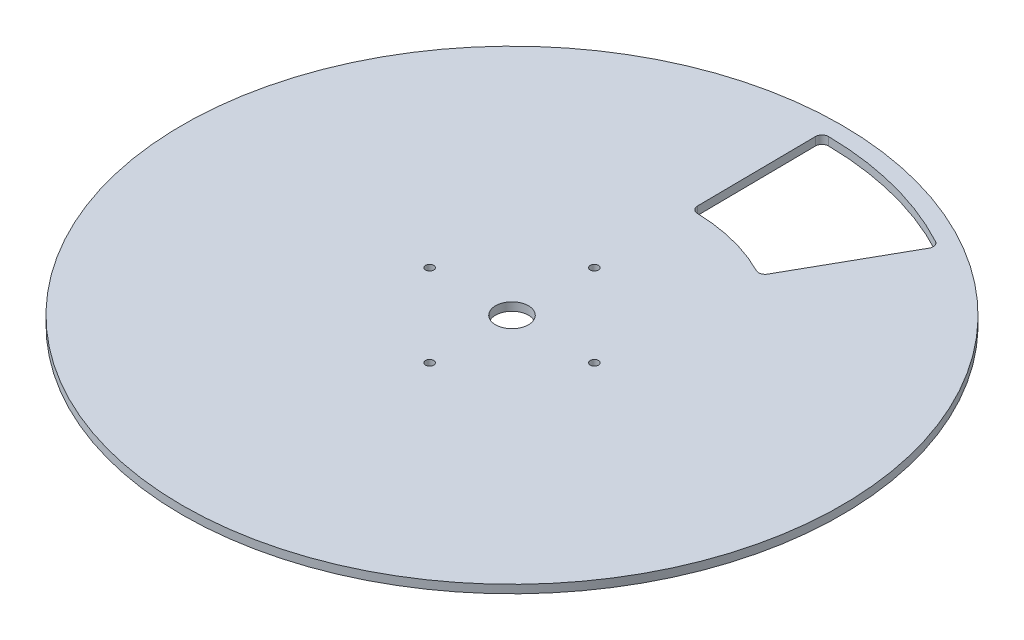
ISO-10303-21;
HEADER;
FILE_DESCRIPTION(('STEP AP214'),'2;1');
FILE_NAME('part.step','',(''),(''),'','','');
FILE_SCHEMA(('AUTOMOTIVE_DESIGN { 1 0 10303 214 1 1 1 1 }'));
ENDSEC;
DATA;
#1=APPLICATION_CONTEXT('core data for automotive mechanical design processes');
#2=APPLICATION_PROTOCOL_DEFINITION('international standard','automotive_design',2000,#1);
#3=PRODUCT_CONTEXT('',#1,'mechanical');
#4=PRODUCT('Part','Part','',(#3));
#5=PRODUCT_RELATED_PRODUCT_CATEGORY('part','',(#4));
#6=PRODUCT_DEFINITION_FORMATION('','',#4);
#7=PRODUCT_DEFINITION_CONTEXT('part definition',#1,'design');
#8=PRODUCT_DEFINITION('design','',#6,#7);
#9=PRODUCT_DEFINITION_SHAPE('','',#8);
#10=(LENGTH_UNIT() NAMED_UNIT(*) SI_UNIT(.MILLI.,.METRE.));
#11=(NAMED_UNIT(*) PLANE_ANGLE_UNIT() SI_UNIT($,.RADIAN.));
#12=(NAMED_UNIT(*) SI_UNIT($,.STERADIAN.) SOLID_ANGLE_UNIT());
#13=UNCERTAINTY_MEASURE_WITH_UNIT(LENGTH_MEASURE(1.E-05),#10,'distance_accuracy_value','');
#14=(GEOMETRIC_REPRESENTATION_CONTEXT(3) GLOBAL_UNCERTAINTY_ASSIGNED_CONTEXT((#13)) GLOBAL_UNIT_ASSIGNED_CONTEXT((#10,
#11,#12)) REPRESENTATION_CONTEXT('',''));
#15=CARTESIAN_POINT('',(0.,0.,0.));
#16=DIRECTION('',(0.,0.,1.));
#17=DIRECTION('',(1.,0.,0.));
#18=AXIS2_PLACEMENT_3D('',#15,#16,#17);
#19=CARTESIAN_POINT('',(0.,3.175,0.));
#20=DIRECTION('',(0.,-1.,0.));
#21=DIRECTION('',(0.,0.,-1.));
#22=AXIS2_PLACEMENT_3D('',#19,#20,#21);
#23=CYLINDRICAL_SURFACE('',#22,127.);
#24=CARTESIAN_POINT('',(0.,3.175,0.));
#25=DIRECTION('',(0.,1.,0.));
#26=DIRECTION('',(0.,0.,1.));
#27=AXIS2_PLACEMENT_3D('',#24,#25,#26);
#28=CIRCLE('',#27,127.);
#29=CARTESIAN_POINT('',(0.,3.175,127.));
#30=VERTEX_POINT('',#29);
#31=EDGE_CURVE('E139',#30,#30,#28,.T.);
#32=ORIENTED_EDGE('',*,*,#31,.F.);
#33=EDGE_LOOP('',(#32));
#34=FACE_BOUND('',#33,.T.);
#35=CARTESIAN_POINT('',(0.,0.,0.));
#36=DIRECTION('',(0.,1.,0.));
#37=DIRECTION('',(0.,0.,1.));
#38=AXIS2_PLACEMENT_3D('',#35,#36,#37);
#39=CIRCLE('',#38,127.);
#40=CARTESIAN_POINT('',(0.,0.,127.));
#41=VERTEX_POINT('',#40);
#42=EDGE_CURVE('E135',#41,#41,#39,.T.);
#43=ORIENTED_EDGE('',*,*,#42,.T.);
#44=EDGE_LOOP('',(#43));
#45=FACE_BOUND('',#44,.T.);
#46=ADVANCED_FACE('F33',(#34,#45),#23,.T.);
#47=CARTESIAN_POINT('',(0.,3.175,0.));
#48=DIRECTION('',(0.,1.,0.));
#49=DIRECTION('',(0.,0.,1.));
#50=AXIS2_PLACEMENT_3D('',#47,#48,#49);
#51=PLANE('',#50);
#52=CARTESIAN_POINT('',(31.75,3.175,-1.10854532508269E-13));
#53=DIRECTION('',(0.,1.,0.));
#54=DIRECTION('',(1.,0.,0.));
#55=AXIS2_PLACEMENT_3D('',#52,#53,#54);
#56=CIRCLE('',#55,1.5875);
#57=CARTESIAN_POINT('',(33.3375,3.175,-1.16397259133683E-13));
#58=VERTEX_POINT('',#57);
#59=EDGE_CURVE('E208',#58,#58,#56,.T.);
#60=ORIENTED_EDGE('',*,*,#59,.F.);
#61=EDGE_LOOP('',(#60));
#62=FACE_BOUND('',#61,.T.);
#63=CARTESIAN_POINT('',(0.,3.175,-31.75));
#64=DIRECTION('',(0.,1.,0.));
#65=DIRECTION('',(0.,0.,-1.));
#66=AXIS2_PLACEMENT_3D('',#63,#64,#65);
#67=CIRCLE('',#66,1.5875);
#68=CARTESIAN_POINT('',(0.,3.175,-33.3375));
#69=VERTEX_POINT('',#68);
#70=EDGE_CURVE('E202',#69,#69,#67,.T.);
#71=ORIENTED_EDGE('',*,*,#70,.F.);
#72=EDGE_LOOP('',(#71));
#73=FACE_BOUND('',#72,.T.);
#74=CARTESIAN_POINT('',(-31.75,3.175,3.32563597524808E-13));
#75=DIRECTION('',(0.,1.,0.));
#76=DIRECTION('',(-1.,0.,0.));
#77=AXIS2_PLACEMENT_3D('',#74,#75,#76);
#78=CIRCLE('',#77,1.5875);
#79=CARTESIAN_POINT('',(-33.3375,3.175,3.49191777401049E-13));
#80=VERTEX_POINT('',#79);
#81=EDGE_CURVE('E196',#80,#80,#78,.T.);
#82=ORIENTED_EDGE('',*,*,#81,.F.);
#83=EDGE_LOOP('',(#82));
#84=FACE_BOUND('',#83,.T.);
#85=CARTESIAN_POINT('',(0.,3.175,31.75));
#86=DIRECTION('',(0.,1.,0.));
#87=DIRECTION('',(0.,0.,1.));
#88=AXIS2_PLACEMENT_3D('',#85,#86,#87);
#89=CIRCLE('',#88,1.5875);
#90=CARTESIAN_POINT('',(0.,3.175,33.3375));
#91=VERTEX_POINT('',#90);
#92=EDGE_CURVE('E188',#91,#91,#89,.T.);
#93=ORIENTED_EDGE('',*,*,#92,.F.);
#94=EDGE_LOOP('',(#93));
#95=FACE_BOUND('',#94,.T.);
#96=CARTESIAN_POINT('',(0.0105004159452068,3.175,1.05154165394142));
#97=DIRECTION('',(0.,-1.,0.));
#98=DIRECTION('',(0.,0.,-1.));
#99=AXIS2_PLACEMENT_3D('',#96,#97,#98);
#100=CIRCLE('',#99,70.7626606637661);
#101=CARTESIAN_POINT('',(1.7562073903253,3.175,-69.6895825340082));
#102=VERTEX_POINT('',#101);
#103=CARTESIAN_POINT('',(32.1700210350617,3.175,-61.981143341733));
#104=VERTEX_POINT('',#103);
#105=EDGE_CURVE('E182',#102,#104,#100,.T.);
#106=ORIENTED_EDGE('',*,*,#105,.F.);
#107=CARTESIAN_POINT('',(1.81886890804288,3.175,-72.2288094900318));
#108=DIRECTION('',(0.,1.,0.));
#109=DIRECTION('',(0.,0.,1.));
#110=AXIS2_PLACEMENT_3D('',#107,#108,#109);
#111=CIRCLE('',#110,2.54);
#112=CARTESIAN_POINT('',(-0.721004463508169,3.175,-72.2034469884614));
#113=VERTEX_POINT('',#112);
#114=EDGE_CURVE('E41',#102,#113,#111,.F.);
#115=ORIENTED_EDGE('',*,*,#114,.T.);
#116=DIRECTION('',(0.00998523683874398,0.,0.99995014627994));
#117=VECTOR('',#116,1.);
#118=CARTESIAN_POINT('',(-0.69608151012217,3.175,-69.7075912279492));
#119=LINE('',#118,#117);
#120=CARTESIAN_POINT('',(-1.17908155429488,3.175,-118.076595651532));
#121=VERTEX_POINT('',#120);
#122=EDGE_CURVE('E114',#121,#113,#119,.T.);
#123=ORIENTED_EDGE('',*,*,#122,.F.);
#124=CARTESIAN_POINT('',(1.36079181725616,3.175,-118.101958153102));
#125=DIRECTION('',(0.,1.,0.));
#126=DIRECTION('',(0.,0.,1.));
#127=AXIS2_PLACEMENT_3D('',#124,#125,#126);
#128=CIRCLE('',#127,2.54);
#129=CARTESIAN_POINT('',(1.39046106139556,3.175,-120.641784866867));
#130=VERTEX_POINT('',#129);
#131=EDGE_CURVE('E98',#121,#130,#128,.F.);
#132=ORIENTED_EDGE('',*,*,#131,.T.);
#133=CARTESIAN_POINT('',(-0.00867728375355766,3.175,-0.868967987320571));
#134=DIRECTION('',(0.,1.,0.));
#135=DIRECTION('',(0.,0.,-1.));
#136=AXIS2_PLACEMENT_3D('',#133,#134,#135);
#137=CIRCLE('',#136,119.780988689233);
#138=CARTESIAN_POINT('',(56.9599757170439,3.175,-106.235271076329));
#139=VERTEX_POINT('',#138);
#140=EDGE_CURVE('E124',#139,#130,#137,.T.);
#141=ORIENTED_EDGE('',*,*,#140,.F.);
#142=CARTESIAN_POINT('',(55.7519344393296,3.175,-104.000939795758));
#143=DIRECTION('',(0.,1.,0.));
#144=DIRECTION('',(0.,0.,1.));
#145=AXIS2_PLACEMENT_3D('',#142,#143,#144);
#146=CIRCLE('',#145,2.54);
#147=CARTESIAN_POINT('',(57.9642105522736,3.175,-102.752967680646));
#148=VERTEX_POINT('',#147);
#149=EDGE_CURVE('E158',#139,#148,#146,.F.);
#150=ORIENTED_EDGE('',*,*,#149,.T.);
#151=DIRECTION('',(0.491327604374815,0.,-0.870974847615765));
#152=VECTOR('',#151,1.);
#153=CARTESIAN_POINT('',(34.3192331655808,3.175,-60.8375931059612));
#154=LINE('',#153,#152);
#155=CARTESIAN_POINT('',(35.5366514586879,3.175,-62.9957065579274));
#156=VERTEX_POINT('',#155);
#157=EDGE_CURVE('E128',#156,#148,#154,.T.);
#158=ORIENTED_EDGE('',*,*,#157,.F.);
#159=CARTESIAN_POINT('',(33.3243753457439,3.175,-64.2436786730394));
#160=DIRECTION('',(0.,1.,0.));
#161=DIRECTION('',(0.,0.,1.));
#162=AXIS2_PLACEMENT_3D('',#159,#160,#161);
#163=CIRCLE('',#162,2.54);
#164=EDGE_CURVE('E162',#156,#104,#163,.F.);
#165=ORIENTED_EDGE('',*,*,#164,.T.);
#166=EDGE_LOOP('',(#106,#115,#123,#132,#141,#150,#158,#165));
#167=FACE_BOUND('',#166,.T.);
#168=CARTESIAN_POINT('',(0.,3.175,0.));
#169=DIRECTION('',(0.,1.,0.));
#170=DIRECTION('',(0.,0.,1.));
#171=AXIS2_PLACEMENT_3D('',#168,#169,#170);
#172=CIRCLE('',#171,6.35);
#173=CARTESIAN_POINT('',(0.,3.175,6.35));
#174=VERTEX_POINT('',#173);
#175=EDGE_CURVE('E136',#174,#174,#172,.T.);
#176=ORIENTED_EDGE('',*,*,#175,.F.);
#177=EDGE_LOOP('',(#176));
#178=FACE_BOUND('',#177,.T.);
#179=ORIENTED_EDGE('',*,*,#31,.T.);
#180=EDGE_LOOP('',(#179));
#181=FACE_BOUND('',#180,.T.);
#182=ADVANCED_FACE('F121',(#62,#73,#84,#95,#167,#178,#181),#51,.T.);
#183=CARTESIAN_POINT('',(0.,0.,0.));
#184=DIRECTION('',(0.,1.,0.));
#185=DIRECTION('',(0.,0.,1.));
#186=AXIS2_PLACEMENT_3D('',#183,#184,#185);
#187=PLANE('',#186);
#188=CARTESIAN_POINT('',(31.75,0.,-1.10854532508269E-13));
#189=DIRECTION('',(0.,1.,0.));
#190=DIRECTION('',(1.,0.,0.));
#191=AXIS2_PLACEMENT_3D('',#188,#189,#190);
#192=CIRCLE('',#191,1.5875);
#193=CARTESIAN_POINT('',(33.3375,0.,-1.16397259133683E-13));
#194=VERTEX_POINT('',#193);
#195=EDGE_CURVE('E194',#194,#194,#192,.T.);
#196=ORIENTED_EDGE('',*,*,#195,.T.);
#197=EDGE_LOOP('',(#196));
#198=FACE_BOUND('',#197,.T.);
#199=CARTESIAN_POINT('',(0.,0.,-31.75));
#200=DIRECTION('',(0.,1.,0.));
#201=DIRECTION('',(0.,0.,-1.));
#202=AXIS2_PLACEMENT_3D('',#199,#200,#201);
#203=CIRCLE('',#202,1.5875);
#204=CARTESIAN_POINT('',(0.,0.,-33.3375));
#205=VERTEX_POINT('',#204);
#206=EDGE_CURVE('E205',#205,#205,#203,.T.);
#207=ORIENTED_EDGE('',*,*,#206,.T.);
#208=EDGE_LOOP('',(#207));
#209=FACE_BOUND('',#208,.T.);
#210=CARTESIAN_POINT('',(-31.75,0.,3.32563597524808E-13));
#211=DIRECTION('',(0.,1.,0.));
#212=DIRECTION('',(-1.,0.,0.));
#213=AXIS2_PLACEMENT_3D('',#210,#211,#212);
#214=CIRCLE('',#213,1.5875);
#215=CARTESIAN_POINT('',(-33.3375,0.,3.49191777401049E-13));
#216=VERTEX_POINT('',#215);
#217=EDGE_CURVE('E199',#216,#216,#214,.T.);
#218=ORIENTED_EDGE('',*,*,#217,.T.);
#219=EDGE_LOOP('',(#218));
#220=FACE_BOUND('',#219,.T.);
#221=CARTESIAN_POINT('',(0.,0.,31.75));
#222=DIRECTION('',(0.,1.,0.));
#223=DIRECTION('',(0.,0.,1.));
#224=AXIS2_PLACEMENT_3D('',#221,#222,#223);
#225=CIRCLE('',#224,1.5875);
#226=CARTESIAN_POINT('',(0.,0.,33.3375));
#227=VERTEX_POINT('',#226);
#228=EDGE_CURVE('E185',#227,#227,#225,.T.);
#229=ORIENTED_EDGE('',*,*,#228,.T.);
#230=EDGE_LOOP('',(#229));
#231=FACE_BOUND('',#230,.T.);
#232=CARTESIAN_POINT('',(-0.00867728375355766,0.,-0.868967987320571));
#233=DIRECTION('',(0.,1.,0.));
#234=DIRECTION('',(0.,0.,-1.));
#235=AXIS2_PLACEMENT_3D('',#232,#233,#234);
#236=CIRCLE('',#235,119.780988689233);
#237=CARTESIAN_POINT('',(56.9599757170439,0.,-106.235271076329));
#238=VERTEX_POINT('',#237);
#239=CARTESIAN_POINT('',(1.39046106139556,0.,-120.641784866867));
#240=VERTEX_POINT('',#239);
#241=EDGE_CURVE('E179',#238,#240,#236,.T.);
#242=ORIENTED_EDGE('',*,*,#241,.T.);
#243=CARTESIAN_POINT('',(1.36079181725616,0.,-118.101958153102));
#244=DIRECTION('',(0.,1.,0.));
#245=DIRECTION('',(0.,0.,1.));
#246=AXIS2_PLACEMENT_3D('',#243,#244,#245);
#247=CIRCLE('',#246,2.54);
#248=CARTESIAN_POINT('',(-1.17908155429488,0.,-118.076595651532));
#249=VERTEX_POINT('',#248);
#250=EDGE_CURVE('E108',#240,#249,#247,.T.);
#251=ORIENTED_EDGE('',*,*,#250,.T.);
#252=DIRECTION('',(0.00998523683874398,0.,0.99995014627994));
#253=VECTOR('',#252,1.);
#254=CARTESIAN_POINT('',(-0.69608151012217,0.,-69.7075912279492));
#255=LINE('',#254,#253);
#256=CARTESIAN_POINT('',(-0.721004463508169,0.,-72.2034469884614));
#257=VERTEX_POINT('',#256);
#258=EDGE_CURVE('E116',#249,#257,#255,.T.);
#259=ORIENTED_EDGE('',*,*,#258,.T.);
#260=CARTESIAN_POINT('',(1.81886890804288,0.,-72.2288094900318));
#261=DIRECTION('',(0.,1.,0.));
#262=DIRECTION('',(0.,0.,1.));
#263=AXIS2_PLACEMENT_3D('',#260,#261,#262);
#264=CIRCLE('',#263,2.54);
#265=CARTESIAN_POINT('',(1.7562073903253,0.,-69.6895825340082));
#266=VERTEX_POINT('',#265);
#267=EDGE_CURVE('E11',#257,#266,#264,.T.);
#268=ORIENTED_EDGE('',*,*,#267,.T.);
#269=CARTESIAN_POINT('',(0.0105004159452068,0.,1.05154165394142));
#270=DIRECTION('',(0.,-1.,0.));
#271=DIRECTION('',(0.,0.,-1.));
#272=AXIS2_PLACEMENT_3D('',#269,#270,#271);
#273=CIRCLE('',#272,70.7626606637661);
#274=CARTESIAN_POINT('',(32.1700210350617,0.,-61.981143341733));
#275=VERTEX_POINT('',#274);
#276=EDGE_CURVE('E123',#266,#275,#273,.T.);
#277=ORIENTED_EDGE('',*,*,#276,.T.);
#278=CARTESIAN_POINT('',(33.3243753457439,0.,-64.2436786730394));
#279=DIRECTION('',(0.,1.,0.));
#280=DIRECTION('',(0.,0.,1.));
#281=AXIS2_PLACEMENT_3D('',#278,#279,#280);
#282=CIRCLE('',#281,2.54);
#283=CARTESIAN_POINT('',(35.5366514586879,0.,-62.9957065579274));
#284=VERTEX_POINT('',#283);
#285=EDGE_CURVE('E164',#275,#284,#282,.T.);
#286=ORIENTED_EDGE('',*,*,#285,.T.);
#287=DIRECTION('',(0.491327604374815,0.,-0.870974847615765));
#288=VECTOR('',#287,1.);
#289=CARTESIAN_POINT('',(34.3192331655808,0.,-60.8375931059612));
#290=LINE('',#289,#288);
#291=CARTESIAN_POINT('',(57.9642105522736,0.,-102.752967680646));
#292=VERTEX_POINT('',#291);
#293=EDGE_CURVE('E126',#284,#292,#290,.T.);
#294=ORIENTED_EDGE('',*,*,#293,.T.);
#295=CARTESIAN_POINT('',(55.7519344393296,0.,-104.000939795758));
#296=DIRECTION('',(0.,1.,0.));
#297=DIRECTION('',(0.,0.,1.));
#298=AXIS2_PLACEMENT_3D('',#295,#296,#297);
#299=CIRCLE('',#298,2.54);
#300=EDGE_CURVE('E160',#292,#238,#299,.T.);
#301=ORIENTED_EDGE('',*,*,#300,.T.);
#302=EDGE_LOOP('',(#242,#251,#259,#268,#277,#286,#294,#301));
#303=FACE_BOUND('',#302,.T.);
#304=CARTESIAN_POINT('',(0.,0.,0.));
#305=DIRECTION('',(0.,1.,0.));
#306=DIRECTION('',(0.,0.,1.));
#307=AXIS2_PLACEMENT_3D('',#304,#305,#306);
#308=CIRCLE('',#307,6.35);
#309=CARTESIAN_POINT('',(0.,0.,6.35));
#310=VERTEX_POINT('',#309);
#311=EDGE_CURVE('E132',#310,#310,#308,.T.);
#312=ORIENTED_EDGE('',*,*,#311,.T.);
#313=EDGE_LOOP('',(#312));
#314=FACE_BOUND('',#313,.T.);
#315=ORIENTED_EDGE('',*,*,#42,.F.);
#316=EDGE_LOOP('',(#315));
#317=FACE_BOUND('',#316,.T.);
#318=ADVANCED_FACE('F169',(#198,#209,#220,#231,#303,#314,#317),#187,.F.);
#319=CARTESIAN_POINT('',(0.,0.,0.));
#320=DIRECTION('',(0.,1.,0.));
#321=DIRECTION('',(0.,0.,1.));
#322=AXIS2_PLACEMENT_3D('',#319,#320,#321);
#323=CYLINDRICAL_SURFACE('',#322,6.35);
#324=ORIENTED_EDGE('',*,*,#311,.F.);
#325=EDGE_LOOP('',(#324));
#326=FACE_BOUND('',#325,.T.);
#327=ORIENTED_EDGE('',*,*,#175,.T.);
#328=EDGE_LOOP('',(#327));
#329=FACE_BOUND('',#328,.T.);
#330=ADVANCED_FACE('F281',(#326,#329),#323,.F.);
#331=CARTESIAN_POINT('',(0.0105004159452068,0.,1.05154165394142));
#332=DIRECTION('',(0.,1.,0.));
#333=DIRECTION('',(0.,0.,1.));
#334=AXIS2_PLACEMENT_3D('',#331,#332,#333);
#335=CYLINDRICAL_SURFACE('',#334,70.7626606637661);
#336=ORIENTED_EDGE('',*,*,#105,.T.);
#337=DIRECTION('',(0.,1.,0.));
#338=VECTOR('',#337,1.);
#339=CARTESIAN_POINT('',(32.1700210350617,0.,-61.981143341733));
#340=LINE('',#339,#338);
#341=EDGE_CURVE('E48',#104,#275,#340,.F.);
#342=ORIENTED_EDGE('',*,*,#341,.T.);
#343=ORIENTED_EDGE('',*,*,#276,.F.);
#344=DIRECTION('',(0.,1.,0.));
#345=VECTOR('',#344,1.);
#346=CARTESIAN_POINT('',(1.7562073903253,0.,-69.6895825340082));
#347=LINE('',#346,#345);
#348=EDGE_CURVE('E153',#266,#102,#347,.T.);
#349=ORIENTED_EDGE('',*,*,#348,.T.);
#350=EDGE_LOOP('',(#336,#342,#343,#349));
#351=FACE_BOUND('',#350,.T.);
#352=ADVANCED_FACE('F183',(#351),#335,.T.);
#353=CARTESIAN_POINT('',(-0.69608151012217,0.,-69.7075912279492));
#354=DIRECTION('',(-0.99995014627994,0.,0.00998523683874398));
#355=DIRECTION('',(0.00998523683874398,0.,0.99995014627994));
#356=AXIS2_PLACEMENT_3D('',#353,#354,#355);
#357=PLANE('',#356);
#358=ORIENTED_EDGE('',*,*,#258,.F.);
#359=DIRECTION('',(0.,-1.,0.));
#360=VECTOR('',#359,1.);
#361=CARTESIAN_POINT('',(-1.17908155429488,3.175,-118.076595651532));
#362=LINE('',#361,#360);
#363=EDGE_CURVE('E102',#249,#121,#362,.F.);
#364=ORIENTED_EDGE('',*,*,#363,.T.);
#365=ORIENTED_EDGE('',*,*,#122,.T.);
#366=DIRECTION('',(0.,-1.,0.));
#367=VECTOR('',#366,1.);
#368=CARTESIAN_POINT('',(-0.721004463508169,0.,-72.2034469884614));
#369=LINE('',#368,#367);
#370=EDGE_CURVE('E118',#113,#257,#369,.T.);
#371=ORIENTED_EDGE('',*,*,#370,.T.);
#372=EDGE_LOOP('',(#358,#364,#365,#371));
#373=FACE_BOUND('',#372,.T.);
#374=ADVANCED_FACE('F113',(#373),#357,.F.);
#375=CARTESIAN_POINT('',(-0.00867728375355766,0.,-0.868967987320571));
#376=DIRECTION('',(0.,1.,0.));
#377=DIRECTION('',(0.,0.,1.));
#378=AXIS2_PLACEMENT_3D('',#375,#376,#377);
#379=CYLINDRICAL_SURFACE('',#378,119.780988689233);
#380=ORIENTED_EDGE('',*,*,#140,.T.);
#381=DIRECTION('',(0.,1.,0.));
#382=VECTOR('',#381,1.);
#383=CARTESIAN_POINT('',(1.39046106139556,0.,-120.641784866867));
#384=LINE('',#383,#382);
#385=EDGE_CURVE('E103',#130,#240,#384,.F.);
#386=ORIENTED_EDGE('',*,*,#385,.T.);
#387=ORIENTED_EDGE('',*,*,#241,.F.);
#388=DIRECTION('',(0.,1.,0.));
#389=VECTOR('',#388,1.);
#390=CARTESIAN_POINT('',(56.9599757170439,0.,-106.235271076329));
#391=LINE('',#390,#389);
#392=EDGE_CURVE('E117',#238,#139,#391,.T.);
#393=ORIENTED_EDGE('',*,*,#392,.T.);
#394=EDGE_LOOP('',(#380,#386,#387,#393));
#395=FACE_BOUND('',#394,.T.);
#396=ADVANCED_FACE('F244',(#395),#379,.F.);
#397=CARTESIAN_POINT('',(34.3192331655808,0.,-60.8375931059612));
#398=DIRECTION('',(0.870974847615765,0.,0.491327604374815));
#399=DIRECTION('',(0.491327604374815,0.,-0.870974847615765));
#400=AXIS2_PLACEMENT_3D('',#397,#398,#399);
#401=PLANE('',#400);
#402=ORIENTED_EDGE('',*,*,#157,.T.);
#403=DIRECTION('',(0.,-1.,0.));
#404=VECTOR('',#403,1.);
#405=CARTESIAN_POINT('',(57.9642105522736,0.,-102.752967680646));
#406=LINE('',#405,#404);
#407=EDGE_CURVE('E151',#148,#292,#406,.T.);
#408=ORIENTED_EDGE('',*,*,#407,.T.);
#409=ORIENTED_EDGE('',*,*,#293,.F.);
#410=DIRECTION('',(0.,-1.,0.));
#411=VECTOR('',#410,1.);
#412=CARTESIAN_POINT('',(35.5366514586879,3.175,-62.9957065579274));
#413=LINE('',#412,#411);
#414=EDGE_CURVE('E148',#284,#156,#413,.F.);
#415=ORIENTED_EDGE('',*,*,#414,.T.);
#416=EDGE_LOOP('',(#402,#408,#409,#415));
#417=FACE_BOUND('',#416,.T.);
#418=ADVANCED_FACE('F176',(#417),#401,.F.);
#419=CARTESIAN_POINT('',(0.,0.,31.75));
#420=DIRECTION('',(0.,1.,0.));
#421=DIRECTION('',(0.,0.,1.));
#422=AXIS2_PLACEMENT_3D('',#419,#420,#421);
#423=CYLINDRICAL_SURFACE('',#422,1.5875);
#424=ORIENTED_EDGE('',*,*,#228,.F.);
#425=EDGE_LOOP('',(#424));
#426=FACE_BOUND('',#425,.T.);
#427=ORIENTED_EDGE('',*,*,#92,.T.);
#428=EDGE_LOOP('',(#427));
#429=FACE_BOUND('',#428,.T.);
#430=ADVANCED_FACE('F232',(#426,#429),#423,.F.);
#431=CARTESIAN_POINT('',(-31.75,0.,3.32563597524808E-13));
#432=DIRECTION('',(0.,1.,0.));
#433=DIRECTION('',(0.,0.,1.));
#434=AXIS2_PLACEMENT_3D('',#431,#432,#433);
#435=CYLINDRICAL_SURFACE('',#434,1.5875);
#436=ORIENTED_EDGE('',*,*,#217,.F.);
#437=EDGE_LOOP('',(#436));
#438=FACE_BOUND('',#437,.T.);
#439=ORIENTED_EDGE('',*,*,#81,.T.);
#440=EDGE_LOOP('',(#439));
#441=FACE_BOUND('',#440,.T.);
#442=ADVANCED_FACE('F234',(#438,#441),#435,.F.);
#443=CARTESIAN_POINT('',(0.,0.,-31.75));
#444=DIRECTION('',(0.,1.,0.));
#445=DIRECTION('',(0.,0.,1.));
#446=AXIS2_PLACEMENT_3D('',#443,#444,#445);
#447=CYLINDRICAL_SURFACE('',#446,1.5875);
#448=ORIENTED_EDGE('',*,*,#206,.F.);
#449=EDGE_LOOP('',(#448));
#450=FACE_BOUND('',#449,.T.);
#451=ORIENTED_EDGE('',*,*,#70,.T.);
#452=EDGE_LOOP('',(#451));
#453=FACE_BOUND('',#452,.T.);
#454=ADVANCED_FACE('F219',(#450,#453),#447,.F.);
#455=CARTESIAN_POINT('',(31.75,0.,-1.10854532508269E-13));
#456=DIRECTION('',(0.,1.,0.));
#457=DIRECTION('',(0.,0.,1.));
#458=AXIS2_PLACEMENT_3D('',#455,#456,#457);
#459=CYLINDRICAL_SURFACE('',#458,1.5875);
#460=ORIENTED_EDGE('',*,*,#195,.F.);
#461=EDGE_LOOP('',(#460));
#462=FACE_BOUND('',#461,.T.);
#463=ORIENTED_EDGE('',*,*,#59,.T.);
#464=EDGE_LOOP('',(#463));
#465=FACE_BOUND('',#464,.T.);
#466=ADVANCED_FACE('F216',(#462,#465),#459,.F.);
#467=CARTESIAN_POINT('',(1.36079181725616,0.,-118.101958153102));
#468=DIRECTION('',(0.,1.,0.));
#469=DIRECTION('',(0.,0.,1.));
#470=AXIS2_PLACEMENT_3D('',#467,#468,#469);
#471=CYLINDRICAL_SURFACE('',#470,2.54);
#472=ORIENTED_EDGE('',*,*,#250,.F.);
#473=ORIENTED_EDGE('',*,*,#385,.F.);
#474=ORIENTED_EDGE('',*,*,#131,.F.);
#475=ORIENTED_EDGE('',*,*,#363,.F.);
#476=EDGE_LOOP('',(#472,#473,#474,#475));
#477=FACE_BOUND('',#476,.T.);
#478=ADVANCED_FACE('F101',(#477),#471,.F.);
#479=CARTESIAN_POINT('',(55.7519344393296,0.,-104.000939795758));
#480=DIRECTION('',(0.,1.,0.));
#481=DIRECTION('',(0.,0.,1.));
#482=AXIS2_PLACEMENT_3D('',#479,#480,#481);
#483=CYLINDRICAL_SURFACE('',#482,2.54);
#484=ORIENTED_EDGE('',*,*,#300,.F.);
#485=ORIENTED_EDGE('',*,*,#407,.F.);
#486=ORIENTED_EDGE('',*,*,#149,.F.);
#487=ORIENTED_EDGE('',*,*,#392,.F.);
#488=EDGE_LOOP('',(#484,#485,#486,#487));
#489=FACE_BOUND('',#488,.T.);
#490=ADVANCED_FACE('F260',(#489),#483,.F.);
#491=CARTESIAN_POINT('',(33.3243753457439,0.,-64.2436786730394));
#492=DIRECTION('',(0.,1.,0.));
#493=DIRECTION('',(0.,0.,1.));
#494=AXIS2_PLACEMENT_3D('',#491,#492,#493);
#495=CYLINDRICAL_SURFACE('',#494,2.54);
#496=ORIENTED_EDGE('',*,*,#285,.F.);
#497=ORIENTED_EDGE('',*,*,#341,.F.);
#498=ORIENTED_EDGE('',*,*,#164,.F.);
#499=ORIENTED_EDGE('',*,*,#414,.F.);
#500=EDGE_LOOP('',(#496,#497,#498,#499));
#501=FACE_BOUND('',#500,.T.);
#502=ADVANCED_FACE('F181',(#501),#495,.F.);
#503=CARTESIAN_POINT('',(1.81886890804288,0.,-72.2288094900318));
#504=DIRECTION('',(0.,1.,0.));
#505=DIRECTION('',(0.,0.,1.));
#506=AXIS2_PLACEMENT_3D('',#503,#504,#505);
#507=CYLINDRICAL_SURFACE('',#506,2.54);
#508=ORIENTED_EDGE('',*,*,#267,.F.);
#509=ORIENTED_EDGE('',*,*,#370,.F.);
#510=ORIENTED_EDGE('',*,*,#114,.F.);
#511=ORIENTED_EDGE('',*,*,#348,.F.);
#512=EDGE_LOOP('',(#508,#509,#510,#511));
#513=FACE_BOUND('',#512,.T.);
#514=ADVANCED_FACE('F35',(#513),#507,.F.);
#515=CLOSED_SHELL('',(#46,#182,#318,#330,#352,#374,#396,#418,#430,#442,#454,#466,#478,#490,#502,#514));
#516=MANIFOLD_SOLID_BREP('B2',#515);
#517=ADVANCED_BREP_SHAPE_REPRESENTATION('',(#18,#516),#14);
#518=SHAPE_DEFINITION_REPRESENTATION(#9,#517);
ENDSEC;
END-ISO-10303-21;
